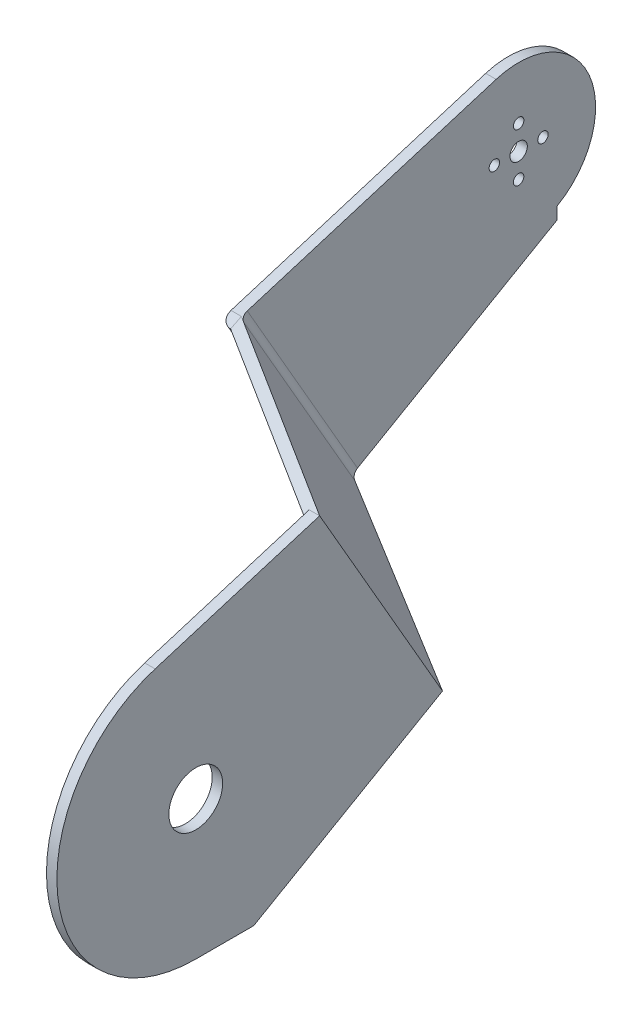
ISO-10303-21;
HEADER;
FILE_DESCRIPTION(('STEP AP214'),'2;1');
FILE_NAME('part.step','',(''),(''),'','','');
FILE_SCHEMA(('AUTOMOTIVE_DESIGN { 1 0 10303 214 1 1 1 1 }'));
ENDSEC;
DATA;
#1=APPLICATION_CONTEXT('core data for automotive mechanical design processes');
#2=APPLICATION_PROTOCOL_DEFINITION('international standard','automotive_design',2000,#1);
#3=PRODUCT_CONTEXT('',#1,'mechanical');
#4=PRODUCT('Part','Part','',(#3));
#5=PRODUCT_RELATED_PRODUCT_CATEGORY('part','',(#4));
#6=PRODUCT_DEFINITION_FORMATION('','',#4);
#7=PRODUCT_DEFINITION_CONTEXT('part definition',#1,'design');
#8=PRODUCT_DEFINITION('design','',#6,#7);
#9=PRODUCT_DEFINITION_SHAPE('','',#8);
#10=(LENGTH_UNIT() NAMED_UNIT(*) SI_UNIT(.MILLI.,.METRE.));
#11=(NAMED_UNIT(*) PLANE_ANGLE_UNIT() SI_UNIT($,.RADIAN.));
#12=(NAMED_UNIT(*) SI_UNIT($,.STERADIAN.) SOLID_ANGLE_UNIT());
#13=UNCERTAINTY_MEASURE_WITH_UNIT(LENGTH_MEASURE(1.E-05),#10,'distance_accuracy_value','');
#14=(GEOMETRIC_REPRESENTATION_CONTEXT(3) GLOBAL_UNCERTAINTY_ASSIGNED_CONTEXT((#13)) GLOBAL_UNIT_ASSIGNED_CONTEXT((#10,
#11,#12)) REPRESENTATION_CONTEXT('',''));
#15=CARTESIAN_POINT('',(0.,0.,0.));
#16=DIRECTION('',(0.,0.,1.));
#17=DIRECTION('',(1.,0.,0.));
#18=AXIS2_PLACEMENT_3D('',#15,#16,#17);
#19=CARTESIAN_POINT('',(251.,0.,0.));
#20=DIRECTION('',(1.,0.,0.));
#21=DIRECTION('',(0.,0.,-1.));
#22=AXIS2_PLACEMENT_3D('',#19,#20,#21);
#23=PLANE('',#22);
#24=DIRECTION('',(0.,0.866377829159594,0.499389083922255));
#25=VECTOR('',#24,1.);
#26=CARTESIAN_POINT('',(251.,27.7260017973894,-48.1011580386023));
#27=LINE('',#26,#25);
#28=CARTESIAN_POINT('',(251.,-9.52824485647312,-69.5748886472593));
#29=VERTEX_POINT('',#28);
#30=CARTESIAN_POINT('',(251.,51.7063736540913,-34.2786252699026));
#31=VERTEX_POINT('',#30);
#32=EDGE_CURVE('E254',#29,#31,#27,.T.);
#33=ORIENTED_EDGE('',*,*,#32,.F.);
#34=DIRECTION('',(0.,0.499389083922256,-0.866377829159594));
#35=VECTOR('',#34,1.);
#36=CARTESIAN_POINT('',(251.,-37.2542466538625,-21.473730608657));
#37=LINE('',#36,#35);
#38=CARTESIAN_POINT('',(251.,-40.,-16.7101907155731));
#39=VERTEX_POINT('',#38);
#40=EDGE_CURVE('E347',#39,#29,#37,.T.);
#41=ORIENTED_EDGE('',*,*,#40,.F.);
#42=DIRECTION('',(0.,0.,-1.));
#43=VECTOR('',#42,1.);
#44=CARTESIAN_POINT('',(251.,-40.,0.));
#45=LINE('',#44,#43);
#46=CARTESIAN_POINT('',(251.,-40.,0.));
#47=VERTEX_POINT('',#46);
#48=EDGE_CURVE('E219',#47,#39,#45,.T.);
#49=ORIENTED_EDGE('',*,*,#48,.F.);
#50=CARTESIAN_POINT('',(251.,0.,0.));
#51=DIRECTION('',(1.,0.,0.));
#52=DIRECTION('',(0.,0.,-1.));
#53=AXIS2_PLACEMENT_3D('',#50,#51,#52);
#54=CIRCLE('',#53,40.);
#55=CARTESIAN_POINT('',(251.,38.2504262101395,11.7006365101509));
#56=VERTEX_POINT('',#55);
#57=EDGE_CURVE('E58',#56,#47,#54,.T.);
#58=ORIENTED_EDGE('',*,*,#57,.F.);
#59=DIRECTION('',(0.,-0.292515912753773,0.956260655253486));
#60=VECTOR('',#59,1.);
#61=CARTESIAN_POINT('',(251.,38.2504262101395,11.7006365101509));
#62=LINE('',#61,#60);
#63=CARTESIAN_POINT('',(251.,52.7438861013477,-35.6797788730056));
#64=VERTEX_POINT('',#63);
#65=EDGE_CURVE('E196',#64,#56,#62,.T.);
#66=ORIENTED_EDGE('',*,*,#65,.F.);
#67=DIRECTION('',(0.,0.866377829159594,0.499389083922256));
#68=VECTOR('',#67,1.);
#69=CARTESIAN_POINT('',(251.,52.7438861013477,-35.6797788730056));
#70=LINE('',#69,#68);
#71=CARTESIAN_POINT('',(251.,52.485068329611,-35.8289640963344));
#72=VERTEX_POINT('',#71);
#73=EDGE_CURVE('E192',#72,#64,#70,.T.);
#74=ORIENTED_EDGE('',*,*,#73,.F.);
#75=DIRECTION('',(0.,-0.448838421555002,0.893612931495518));
#76=VECTOR('',#75,1.);
#77=CARTESIAN_POINT('',(251.,27.541079130089,13.8331642806274));
#78=LINE('',#77,#76);
#79=EDGE_CURVE('E199',#72,#31,#78,.T.);
#80=ORIENTED_EDGE('',*,*,#79,.T.);
#81=EDGE_LOOP('',(#33,#41,#49,#58,#66,#74,#80));
#82=FACE_BOUND('',#81,.T.);
#83=CARTESIAN_POINT('',(251.,0.,0.));
#84=DIRECTION('',(1.,0.,0.));
#85=DIRECTION('',(0.,0.,-1.));
#86=AXIS2_PLACEMENT_3D('',#83,#84,#85);
#87=CIRCLE('',#86,7.75);
#88=CARTESIAN_POINT('',(251.,0.,-7.75));
#89=VERTEX_POINT('',#88);
#90=EDGE_CURVE('E207',#89,#89,#87,.T.);
#91=ORIENTED_EDGE('',*,*,#90,.T.);
#92=EDGE_LOOP('',(#91));
#93=FACE_BOUND('',#92,.T.);
#94=ADVANCED_FACE('F41',(#82,#93),#23,.F.);
#95=CARTESIAN_POINT('',(3.,-40.,0.));
#96=DIRECTION('',(0.,1.,0.));
#97=DIRECTION('',(0.,0.,1.));
#98=AXIS2_PLACEMENT_3D('',#95,#96,#97);
#99=PLANE('',#98);
#100=DIRECTION('',(-1.,0.,0.));
#101=VECTOR('',#100,1.);
#102=CARTESIAN_POINT('',(254.,-40.,0.));
#103=LINE('',#102,#101);
#104=CARTESIAN_POINT('',(254.,-40.,0.));
#105=VERTEX_POINT('',#104);
#106=EDGE_CURVE('E223',#105,#47,#103,.T.);
#107=ORIENTED_EDGE('',*,*,#106,.T.);
#108=ORIENTED_EDGE('',*,*,#48,.T.);
#109=DIRECTION('',(-1.,0.,0.));
#110=VECTOR('',#109,1.);
#111=CARTESIAN_POINT('',(3.,-40.,-16.7101907155731));
#112=LINE('',#111,#110);
#113=CARTESIAN_POINT('',(254.,-40.,-16.7101907155731));
#114=VERTEX_POINT('',#113);
#115=EDGE_CURVE('E45',#114,#39,#112,.T.);
#116=ORIENTED_EDGE('',*,*,#115,.F.);
#117=DIRECTION('',(0.,0.,-1.));
#118=VECTOR('',#117,1.);
#119=CARTESIAN_POINT('',(254.,-40.,0.));
#120=LINE('',#119,#118);
#121=EDGE_CURVE('E215',#105,#114,#120,.T.);
#122=ORIENTED_EDGE('',*,*,#121,.F.);
#123=EDGE_LOOP('',(#107,#108,#116,#122));
#124=FACE_BOUND('',#123,.T.);
#125=ADVANCED_FACE('F43',(#124),#99,.F.);
#126=CARTESIAN_POINT('',(3.,-37.2542466538625,-21.473730608657));
#127=DIRECTION('',(0.,0.866377829159594,0.499389083922256));
#128=DIRECTION('',(0.,-0.499389083922256,0.866377829159594));
#129=AXIS2_PLACEMENT_3D('',#126,#127,#128);
#130=PLANE('',#129);
#131=CARTESIAN_POINT('',(202.,6.09772107490473,-96.683992306114));
#132=DIRECTION('',(0.,0.866377829159594,0.499389083922256));
#133=DIRECTION('',(0.,-0.499389083922256,0.866377829159594));
#134=AXIS2_PLACEMENT_3D('',#131,#132,#133);
#135=CIRCLE('',#134,3.00000000000006);
#136=CARTESIAN_POINT('',(202.,4.59955382313792,-94.0848588186351));
#137=VERTEX_POINT('',#136);
#138=CARTESIAN_POINT('',(199.,6.09772107490468,-96.6839923061139));
#139=VERTEX_POINT('',#138);
#140=EDGE_CURVE('E222',#137,#139,#135,.F.);
#141=ORIENTED_EDGE('',*,*,#140,.T.);
#142=DIRECTION('',(0.,0.499389083922256,-0.866377829159594));
#143=VECTOR('',#142,1.);
#144=CARTESIAN_POINT('',(199.,-37.2542466538625,-21.473730608657));
#145=LINE('',#144,#143);
#146=CARTESIAN_POINT('',(199.,40.3293765594166,-156.071648788865));
#147=VERTEX_POINT('',#146);
#148=EDGE_CURVE('E224',#139,#147,#145,.T.);
#149=ORIENTED_EDGE('',*,*,#148,.T.);
#150=DIRECTION('',(-1.,0.,0.));
#151=VECTOR('',#150,1.);
#152=CARTESIAN_POINT('',(3.,40.3293765594166,-156.071648788865));
#153=LINE('',#152,#151);
#154=CARTESIAN_POINT('',(202.,40.3293765594166,-156.071648788865));
#155=VERTEX_POINT('',#154);
#156=EDGE_CURVE('E140',#155,#147,#153,.T.);
#157=ORIENTED_EDGE('',*,*,#156,.F.);
#158=DIRECTION('',(0.,0.499389083922256,-0.866377829159594));
#159=VECTOR('',#158,1.);
#160=CARTESIAN_POINT('',(202.,-37.2542466538625,-21.473730608657));
#161=LINE('',#160,#159);
#162=CARTESIAN_POINT('',(202.,7.19445562143378,-98.586690074602));
#163=VERTEX_POINT('',#162);
#164=EDGE_CURVE('E168',#163,#155,#161,.T.);
#165=ORIENTED_EDGE('',*,*,#164,.F.);
#166=CARTESIAN_POINT('',(205.,7.19445562143379,-98.586690074602));
#167=DIRECTION('',(0.,0.866377829159594,0.499389083922256));
#168=DIRECTION('',(0.,-0.499389083922256,0.866377829159594));
#169=AXIS2_PLACEMENT_3D('',#166,#167,#168);
#170=CIRCLE('',#169,3.);
#171=CARTESIAN_POINT('',(203.5,5.89700472228584,-96.3357744466186));
#172=VERTEX_POINT('',#171);
#173=EDGE_CURVE('E228',#172,#163,#170,.F.);
#174=ORIENTED_EDGE('',*,*,#173,.F.);
#175=DIRECTION('',(0.866025403784436,-0.24969454196113,0.433188914579801));
#176=VECTOR('',#175,1.);
#177=CARTESIAN_POINT('',(254.,-8.66327759037451,-71.0754990659149));
#178=LINE('',#177,#176);
#179=CARTESIAN_POINT('',(254.,-8.66327759037451,-71.0754990659149));
#180=VERTEX_POINT('',#179);
#181=EDGE_CURVE('E225',#172,#180,#178,.T.);
#182=ORIENTED_EDGE('',*,*,#181,.T.);
#183=DIRECTION('',(0.,0.499389083922255,-0.866377829159594));
#184=VECTOR('',#183,1.);
#185=CARTESIAN_POINT('',(254.,-40.,-16.7101907155731));
#186=LINE('',#185,#184);
#187=EDGE_CURVE('E204',#114,#180,#186,.T.);
#188=ORIENTED_EDGE('',*,*,#187,.F.);
#189=ORIENTED_EDGE('',*,*,#115,.T.);
#190=ORIENTED_EDGE('',*,*,#40,.T.);
#191=DIRECTION('',(-0.866025403784436,0.24969454196113,-0.433188914579801));
#192=VECTOR('',#191,1.);
#193=CARTESIAN_POINT('',(89.0407957191668,37.1682251922945,-150.587445094259));
#194=LINE('',#193,#192);
#195=EDGE_CURVE('E157',#29,#137,#194,.T.);
#196=ORIENTED_EDGE('',*,*,#195,.T.);
#197=EDGE_LOOP('',(#141,#149,#157,#165,#174,#182,#188,#189,#190,#196));
#198=FACE_BOUND('',#197,.T.);
#199=ADVANCED_FACE('F323',(#198),#130,.F.);
#200=CARTESIAN_POINT('',(3.,0.,-156.071648788865));
#201=DIRECTION('',(0.,0.,-1.));
#202=DIRECTION('',(-1.,0.,0.));
#203=AXIS2_PLACEMENT_3D('',#200,#201,#202);
#204=PLANE('',#203);
#205=DIRECTION('',(0.,-1.,0.));
#206=VECTOR('',#205,1.);
#207=CARTESIAN_POINT('',(199.,0.,-156.071648788865));
#208=LINE('',#207,#206);
#209=CARTESIAN_POINT('',(199.,43.7920690464924,-156.071648788865));
#210=VERTEX_POINT('',#209);
#211=EDGE_CURVE('E133',#210,#147,#208,.T.);
#212=ORIENTED_EDGE('',*,*,#211,.F.);
#213=DIRECTION('',(1.,0.,0.));
#214=VECTOR('',#213,1.);
#215=CARTESIAN_POINT('',(199.,43.7920690464924,-156.071648788865));
#216=LINE('',#215,#214);
#217=CARTESIAN_POINT('',(202.,43.7920690464924,-156.071648788865));
#218=VERTEX_POINT('',#217);
#219=EDGE_CURVE('E137',#210,#218,#216,.T.);
#220=ORIENTED_EDGE('',*,*,#219,.T.);
#221=DIRECTION('',(0.,-1.,0.));
#222=VECTOR('',#221,1.);
#223=CARTESIAN_POINT('',(202.,0.,-156.071648788865));
#224=LINE('',#223,#222);
#225=EDGE_CURVE('E156',#218,#155,#224,.T.);
#226=ORIENTED_EDGE('',*,*,#225,.T.);
#227=ORIENTED_EDGE('',*,*,#156,.T.);
#228=EDGE_LOOP('',(#212,#220,#226,#227));
#229=FACE_BOUND('',#228,.T.);
#230=ADVANCED_FACE('F135',(#229),#204,.T.);
#231=CARTESIAN_POINT('',(205.,44.4487022752963,-77.112959465945));
#232=DIRECTION('',(0.,-0.866377829159594,-0.499389083922256));
#233=DIRECTION('',(0.,0.499389083922256,-0.866377829159594));
#234=AXIS2_PLACEMENT_3D('',#231,#232,#233);
#235=CYLINDRICAL_SURFACE('',#234,3.);
#236=DIRECTION('',(0.,-0.866377829159594,-0.499389083922256));
#237=VECTOR('',#236,1.);
#238=CARTESIAN_POINT('',(202.,44.4487022752963,-77.112959465945));
#239=LINE('',#238,#237);
#240=CARTESIAN_POINT('',(202.,62.2749626707045,-66.8377197852876));
#241=VERTEX_POINT('',#240);
#242=EDGE_CURVE('E190',#241,#163,#239,.T.);
#243=ORIENTED_EDGE('',*,*,#242,.F.);
#244=CARTESIAN_POINT('',(205.,62.2749626707045,-66.8377197852876));
#245=DIRECTION('',(0.,-0.956260655253487,-0.292515912753773));
#246=DIRECTION('',(0.,0.292515912753773,-0.956260655253487));
#247=AXIS2_PLACEMENT_3D('',#244,#245,#246);
#248=ELLIPSE('',#247,3.07830504862782,3.);
#249=CARTESIAN_POINT('',(203.5,61.4951473150298,-64.2884337106464));
#250=VERTEX_POINT('',#249);
#251=EDGE_CURVE('E226',#241,#250,#248,.F.);
#252=ORIENTED_EDGE('',*,*,#251,.T.);
#253=DIRECTION('',(0.,-0.866377829159594,-0.499389083922256));
#254=VECTOR('',#253,1.);
#255=CARTESIAN_POINT('',(203.5,8.49613820976462,-94.8376071948518));
#256=LINE('',#255,#254);
#257=EDGE_CURVE('E177',#172,#250,#256,.F.);
#258=ORIENTED_EDGE('',*,*,#257,.F.);
#259=ORIENTED_EDGE('',*,*,#173,.T.);
#260=EDGE_LOOP('',(#243,#252,#258,#259));
#261=FACE_BOUND('',#260,.T.);
#262=ADVANCED_FACE('F317',(#261),#235,.F.);
#263=CARTESIAN_POINT('',(202.,61.6958636676487,-64.6366515701417));
#264=DIRECTION('',(0.,0.866377829159594,0.499389083922255));
#265=DIRECTION('',(0.,-0.499389083922255,0.866377829159594));
#266=AXIS2_PLACEMENT_3D('',#263,#264,#265);
#267=CYLINDRICAL_SURFACE('',#266,3.);
#268=DIRECTION('',(0.,-0.866377829159594,-0.499389083922255));
#269=VECTOR('',#268,1.);
#270=CARTESIAN_POINT('',(202.,41.8538004770004,-72.6111282099781));
#271=LINE('',#270,#269);
#272=CARTESIAN_POINT('',(202.,60.1976964158819,-62.0375180826629));
#273=VERTEX_POINT('',#272);
#274=EDGE_CURVE('E258',#273,#137,#271,.T.);
#275=ORIENTED_EDGE('',*,*,#274,.F.);
#276=CARTESIAN_POINT('',(202.,61.5464351574655,-64.7227836989898));
#277=DIRECTION('',(0.,-0.893612931495518,-0.448838421555002));
#278=DIRECTION('',(0.,-0.448838421555002,0.893612931495519));
#279=AXIS2_PLACEMENT_3D('',#276,#277,#278);
#280=ELLIPSE('',#279,3.00495384711238,3.);
#281=CARTESIAN_POINT('',(199.,61.5464351574655,-64.7227836989898));
#282=VERTEX_POINT('',#281);
#283=EDGE_CURVE('E217',#282,#273,#280,.F.);
#284=ORIENTED_EDGE('',*,*,#283,.F.);
#285=DIRECTION('',(0.,-0.866377829159594,-0.499389083922255));
#286=VECTOR('',#285,1.);
#287=CARTESIAN_POINT('',(199.,61.6958636676487,-64.6366515701417));
#288=LINE('',#287,#286);
#289=EDGE_CURVE('E145',#139,#282,#288,.F.);
#290=ORIENTED_EDGE('',*,*,#289,.F.);
#291=ORIENTED_EDGE('',*,*,#140,.F.);
#292=EDGE_LOOP('',(#275,#284,#290,#291));
#293=FACE_BOUND('',#292,.T.);
#294=ADVANCED_FACE('F335',(#293),#267,.T.);
#295=CARTESIAN_POINT('',(199.,38.2504262101395,11.7006365101509));
#296=DIRECTION('',(0.,-0.956260655253487,-0.292515912753773));
#297=DIRECTION('',(0.,0.292515912753773,-0.956260655253487));
#298=AXIS2_PLACEMENT_3D('',#295,#296,#297);
#299=PLANE('',#298);
#300=DIRECTION('',(0.,0.292515912753773,-0.956260655253487));
#301=VECTOR('',#300,1.);
#302=CARTESIAN_POINT('',(199.,38.2504262101395,11.7006365101509));
#303=LINE('',#302,#301);
#304=CARTESIAN_POINT('',(199.,61.7550857669214,-65.1381957355268));
#305=VERTEX_POINT('',#304);
#306=CARTESIAN_POINT('',(199.,84.2006679089215,-138.51480928312));
#307=VERTEX_POINT('',#306);
#308=EDGE_CURVE('E162',#305,#307,#303,.T.);
#309=ORIENTED_EDGE('',*,*,#308,.F.);
#310=DIRECTION('',(1.,0.,0.));
#311=VECTOR('',#310,1.);
#312=CARTESIAN_POINT('',(182.,61.7550857669214,-65.1381957355268));
#313=LINE('',#312,#311);
#314=CARTESIAN_POINT('',(202.,61.7550857669214,-65.1381957355268));
#315=VERTEX_POINT('',#314);
#316=EDGE_CURVE('E67',#305,#315,#313,.T.);
#317=ORIENTED_EDGE('',*,*,#316,.T.);
#318=DIRECTION('',(0.860356620434527,-0.149093178660264,0.487398922599812));
#319=VECTOR('',#318,1.);
#320=CARTESIAN_POINT('',(202.,61.7550857669214,-65.1381957355268));
#321=LINE('',#320,#319);
#322=EDGE_CURVE('E249',#315,#250,#321,.T.);
#323=ORIENTED_EDGE('',*,*,#322,.T.);
#324=ORIENTED_EDGE('',*,*,#251,.F.);
#325=DIRECTION('',(0.,0.292515912753773,-0.956260655253487));
#326=VECTOR('',#325,1.);
#327=CARTESIAN_POINT('',(202.,38.2504262101395,11.7006365101509));
#328=LINE('',#327,#326);
#329=CARTESIAN_POINT('',(202.,84.2006679089215,-138.51480928312));
#330=VERTEX_POINT('',#329);
#331=EDGE_CURVE('E146',#241,#330,#328,.T.);
#332=ORIENTED_EDGE('',*,*,#331,.T.);
#333=DIRECTION('',(1.,0.,0.));
#334=VECTOR('',#333,1.);
#335=CARTESIAN_POINT('',(199.,84.2006679089215,-138.51480928312));
#336=LINE('',#335,#334);
#337=EDGE_CURVE('E164',#307,#330,#336,.T.);
#338=ORIENTED_EDGE('',*,*,#337,.F.);
#339=EDGE_LOOP('',(#309,#317,#323,#324,#332,#338));
#340=FACE_BOUND('',#339,.T.);
#341=ADVANCED_FACE('F315',(#340),#299,.F.);
#342=CARTESIAN_POINT('',(199.,0.,0.));
#343=DIRECTION('',(-1.,0.,0.));
#344=DIRECTION('',(0.,0.,-1.));
#345=AXIS2_PLACEMENT_3D('',#342,#343,#344);
#346=PLANE('',#345);
#347=CARTESIAN_POINT('',(199.,63.,-145.));
#348=DIRECTION('',(1.,0.,0.));
#349=DIRECTION('',(0.,0.,-1.));
#350=AXIS2_PLACEMENT_3D('',#347,#348,#349);
#351=CIRCLE('',#350,22.1703860683274);
#352=EDGE_CURVE('E153',#210,#307,#351,.T.);
#353=ORIENTED_EDGE('',*,*,#352,.F.);
#354=ORIENTED_EDGE('',*,*,#211,.T.);
#355=ORIENTED_EDGE('',*,*,#148,.F.);
#356=ORIENTED_EDGE('',*,*,#289,.T.);
#357=DIRECTION('',(0.,-0.448838421555002,0.893612931495519));
#358=VECTOR('',#357,1.);
#359=CARTESIAN_POINT('',(199.,23.1880208405676,11.6467368658676));
#360=LINE('',#359,#358);
#361=EDGE_CURVE('E245',#305,#282,#360,.T.);
#362=ORIENTED_EDGE('',*,*,#361,.F.);
#363=ORIENTED_EDGE('',*,*,#308,.T.);
#364=EDGE_LOOP('',(#353,#354,#355,#356,#362,#363));
#365=FACE_BOUND('',#364,.T.);
#366=CARTESIAN_POINT('',(199.,62.9999999999999,-138.));
#367=DIRECTION('',(1.,0.,0.));
#368=DIRECTION('',(0.,0.,-1.));
#369=AXIS2_PLACEMENT_3D('',#366,#367,#368);
#370=CIRCLE('',#369,1.50000000000003);
#371=CARTESIAN_POINT('',(199.,62.9999999999999,-139.5));
#372=VERTEX_POINT('',#371);
#373=EDGE_CURVE('E251',#372,#372,#370,.T.);
#374=ORIENTED_EDGE('',*,*,#373,.T.);
#375=EDGE_LOOP('',(#374));
#376=FACE_BOUND('',#375,.T.);
#377=CARTESIAN_POINT('',(199.,56.,-145.));
#378=DIRECTION('',(1.,0.,0.));
#379=DIRECTION('',(0.,0.,-1.));
#380=AXIS2_PLACEMENT_3D('',#377,#378,#379);
#381=CIRCLE('',#380,1.5);
#382=CARTESIAN_POINT('',(199.,56.,-146.5));
#383=VERTEX_POINT('',#382);
#384=EDGE_CURVE('E277',#383,#383,#381,.T.);
#385=ORIENTED_EDGE('',*,*,#384,.T.);
#386=EDGE_LOOP('',(#385));
#387=FACE_BOUND('',#386,.T.);
#388=CARTESIAN_POINT('',(199.,63.,-152.));
#389=DIRECTION('',(1.,0.,0.));
#390=DIRECTION('',(0.,0.,-1.));
#391=AXIS2_PLACEMENT_3D('',#388,#389,#390);
#392=CIRCLE('',#391,1.5);
#393=CARTESIAN_POINT('',(199.,63.,-153.5));
#394=VERTEX_POINT('',#393);
#395=EDGE_CURVE('E280',#394,#394,#392,.T.);
#396=ORIENTED_EDGE('',*,*,#395,.T.);
#397=EDGE_LOOP('',(#396));
#398=FACE_BOUND('',#397,.T.);
#399=CARTESIAN_POINT('',(199.,70.,-145.));
#400=DIRECTION('',(1.,0.,0.));
#401=DIRECTION('',(0.,0.,-1.));
#402=AXIS2_PLACEMENT_3D('',#399,#400,#401);
#403=CIRCLE('',#402,1.5);
#404=CARTESIAN_POINT('',(199.,70.,-146.5));
#405=VERTEX_POINT('',#404);
#406=EDGE_CURVE('E282',#405,#405,#403,.T.);
#407=ORIENTED_EDGE('',*,*,#406,.T.);
#408=EDGE_LOOP('',(#407));
#409=FACE_BOUND('',#408,.T.);
#410=CARTESIAN_POINT('',(199.,63.,-145.));
#411=DIRECTION('',(1.,0.,0.));
#412=DIRECTION('',(0.,0.,-1.));
#413=AXIS2_PLACEMENT_3D('',#410,#411,#412);
#414=CIRCLE('',#413,2.5);
#415=CARTESIAN_POINT('',(199.,63.,-147.5));
#416=VERTEX_POINT('',#415);
#417=EDGE_CURVE('E172',#416,#416,#414,.T.);
#418=ORIENTED_EDGE('',*,*,#417,.T.);
#419=EDGE_LOOP('',(#418));
#420=FACE_BOUND('',#419,.T.);
#421=ADVANCED_FACE('F159',(#365,#376,#387,#398,#409,#420),#346,.T.);
#422=CARTESIAN_POINT('',(254.,0.,0.));
#423=DIRECTION('',(-1.,0.,0.));
#424=DIRECTION('',(0.,0.,1.));
#425=AXIS2_PLACEMENT_3D('',#422,#423,#424);
#426=CYLINDRICAL_SURFACE('',#425,40.);
#427=ORIENTED_EDGE('',*,*,#106,.F.);
#428=CARTESIAN_POINT('',(254.,0.,0.));
#429=DIRECTION('',(1.,0.,0.));
#430=DIRECTION('',(0.,0.,-1.));
#431=AXIS2_PLACEMENT_3D('',#428,#429,#430);
#432=CIRCLE('',#431,40.);
#433=CARTESIAN_POINT('',(254.,38.2504262101395,11.7006365101509));
#434=VERTEX_POINT('',#433);
#435=EDGE_CURVE('E212',#434,#105,#432,.T.);
#436=ORIENTED_EDGE('',*,*,#435,.F.);
#437=DIRECTION('',(1.,0.,0.));
#438=VECTOR('',#437,1.);
#439=CARTESIAN_POINT('',(251.,38.2504262101395,11.7006365101509));
#440=LINE('',#439,#438);
#441=EDGE_CURVE('E195',#56,#434,#440,.T.);
#442=ORIENTED_EDGE('',*,*,#441,.F.);
#443=ORIENTED_EDGE('',*,*,#57,.T.);
#444=EDGE_LOOP('',(#427,#436,#442,#443));
#445=FACE_BOUND('',#444,.T.);
#446=ADVANCED_FACE('F359',(#445),#426,.T.);
#447=CARTESIAN_POINT('',(254.,0.,0.));
#448=DIRECTION('',(1.,0.,0.));
#449=DIRECTION('',(0.,0.,-1.));
#450=AXIS2_PLACEMENT_3D('',#447,#448,#449);
#451=PLANE('',#450);
#452=CARTESIAN_POINT('',(254.,0.,0.));
#453=DIRECTION('',(1.,0.,0.));
#454=DIRECTION('',(0.,0.,-1.));
#455=AXIS2_PLACEMENT_3D('',#452,#453,#454);
#456=CIRCLE('',#455,7.75);
#457=CARTESIAN_POINT('',(254.,0.,-7.75));
#458=VERTEX_POINT('',#457);
#459=EDGE_CURVE('E11',#458,#458,#456,.T.);
#460=ORIENTED_EDGE('',*,*,#459,.F.);
#461=EDGE_LOOP('',(#460));
#462=FACE_BOUND('',#461,.T.);
#463=ORIENTED_EDGE('',*,*,#435,.T.);
#464=ORIENTED_EDGE('',*,*,#121,.T.);
#465=ORIENTED_EDGE('',*,*,#187,.T.);
#466=DIRECTION('',(0.,0.866377829159594,0.499389083922256));
#467=VECTOR('',#466,1.);
#468=CARTESIAN_POINT('',(254.,52.7438861013477,-35.6797788730056));
#469=LINE('',#468,#467);
#470=CARTESIAN_POINT('',(254.,52.7438861013477,-35.6797788730056));
#471=VERTEX_POINT('',#470);
#472=EDGE_CURVE('E200',#180,#471,#469,.T.);
#473=ORIENTED_EDGE('',*,*,#472,.T.);
#474=DIRECTION('',(0.,-0.292515912753773,0.956260655253486));
#475=VECTOR('',#474,1.);
#476=CARTESIAN_POINT('',(254.,38.2504262101395,11.7006365101509));
#477=LINE('',#476,#475);
#478=EDGE_CURVE('E203',#471,#434,#477,.T.);
#479=ORIENTED_EDGE('',*,*,#478,.T.);
#480=EDGE_LOOP('',(#463,#464,#465,#473,#479));
#481=FACE_BOUND('',#480,.T.);
#482=ADVANCED_FACE('F356',(#462,#481),#451,.T.);
#483=CARTESIAN_POINT('',(251.,38.2504262101395,11.7006365101509));
#484=DIRECTION('',(0.,0.956260655253486,0.292515912753773));
#485=DIRECTION('',(0.,-0.292515912753773,0.956260655253487));
#486=AXIS2_PLACEMENT_3D('',#483,#484,#485);
#487=PLANE('',#486);
#488=ORIENTED_EDGE('',*,*,#478,.F.);
#489=DIRECTION('',(1.,0.,0.));
#490=VECTOR('',#489,1.);
#491=CARTESIAN_POINT('',(251.,52.7438861013477,-35.6797788730056));
#492=LINE('',#491,#490);
#493=EDGE_CURVE('E194',#64,#471,#492,.T.);
#494=ORIENTED_EDGE('',*,*,#493,.F.);
#495=ORIENTED_EDGE('',*,*,#65,.T.);
#496=ORIENTED_EDGE('',*,*,#441,.T.);
#497=EDGE_LOOP('',(#488,#494,#495,#496));
#498=FACE_BOUND('',#497,.T.);
#499=ADVANCED_FACE('F358',(#498),#487,.T.);
#500=CARTESIAN_POINT('',(251.,52.7438861013477,-35.6797788730056));
#501=DIRECTION('',(0.,0.499389083922256,-0.866377829159593));
#502=DIRECTION('',(0.,0.866377829159594,0.499389083922256));
#503=AXIS2_PLACEMENT_3D('',#500,#501,#502);
#504=PLANE('',#503);
#505=DIRECTION('',(0.995078632440276,0.0858480114503153,0.0494836760034669));
#506=VECTOR('',#505,1.);
#507=CARTESIAN_POINT('',(251.029455545782,52.4876095358526,-35.8274993189425));
#508=LINE('',#507,#506);
#509=EDGE_CURVE('E259',#72,#471,#508,.T.);
#510=ORIENTED_EDGE('',*,*,#509,.F.);
#511=ORIENTED_EDGE('',*,*,#73,.T.);
#512=ORIENTED_EDGE('',*,*,#493,.T.);
#513=EDGE_LOOP('',(#510,#511,#512));
#514=FACE_BOUND('',#513,.T.);
#515=ADVANCED_FACE('F300',(#514),#504,.T.);
#516=CARTESIAN_POINT('',(202.,0.,0.));
#517=DIRECTION('',(-1.,0.,0.));
#518=DIRECTION('',(0.,0.,-1.));
#519=AXIS2_PLACEMENT_3D('',#516,#517,#518);
#520=PLANE('',#519);
#521=CARTESIAN_POINT('',(202.,63.,-145.));
#522=DIRECTION('',(1.,0.,0.));
#523=DIRECTION('',(0.,0.,-1.));
#524=AXIS2_PLACEMENT_3D('',#521,#522,#523);
#525=CIRCLE('',#524,2.5);
#526=CARTESIAN_POINT('',(202.,63.,-147.5));
#527=VERTEX_POINT('',#526);
#528=EDGE_CURVE('E166',#527,#527,#525,.T.);
#529=ORIENTED_EDGE('',*,*,#528,.F.);
#530=EDGE_LOOP('',(#529));
#531=FACE_BOUND('',#530,.T.);
#532=CARTESIAN_POINT('',(202.,70.,-145.));
#533=DIRECTION('',(1.,0.,0.));
#534=DIRECTION('',(0.,0.,-1.));
#535=AXIS2_PLACEMENT_3D('',#532,#533,#534);
#536=CIRCLE('',#535,1.5);
#537=CARTESIAN_POINT('',(202.,70.,-146.5));
#538=VERTEX_POINT('',#537);
#539=EDGE_CURVE('E184',#538,#538,#536,.T.);
#540=ORIENTED_EDGE('',*,*,#539,.F.);
#541=EDGE_LOOP('',(#540));
#542=FACE_BOUND('',#541,.T.);
#543=CARTESIAN_POINT('',(202.,63.,-152.));
#544=DIRECTION('',(1.,0.,0.));
#545=DIRECTION('',(0.,0.,-1.));
#546=AXIS2_PLACEMENT_3D('',#543,#544,#545);
#547=CIRCLE('',#546,1.5);
#548=CARTESIAN_POINT('',(202.,63.,-153.5));
#549=VERTEX_POINT('',#548);
#550=EDGE_CURVE('E181',#549,#549,#547,.T.);
#551=ORIENTED_EDGE('',*,*,#550,.F.);
#552=EDGE_LOOP('',(#551));
#553=FACE_BOUND('',#552,.T.);
#554=CARTESIAN_POINT('',(202.,56.,-145.));
#555=DIRECTION('',(1.,0.,0.));
#556=DIRECTION('',(0.,0.,-1.));
#557=AXIS2_PLACEMENT_3D('',#554,#555,#556);
#558=CIRCLE('',#557,1.5);
#559=CARTESIAN_POINT('',(202.,56.,-146.5));
#560=VERTEX_POINT('',#559);
#561=EDGE_CURVE('E178',#560,#560,#558,.T.);
#562=ORIENTED_EDGE('',*,*,#561,.F.);
#563=EDGE_LOOP('',(#562));
#564=FACE_BOUND('',#563,.T.);
#565=CARTESIAN_POINT('',(202.,62.9999999999999,-138.));
#566=DIRECTION('',(1.,0.,0.));
#567=DIRECTION('',(0.,0.,-1.));
#568=AXIS2_PLACEMENT_3D('',#565,#566,#567);
#569=CIRCLE('',#568,1.50000000000003);
#570=CARTESIAN_POINT('',(202.,62.9999999999999,-139.5));
#571=VERTEX_POINT('',#570);
#572=EDGE_CURVE('E174',#571,#571,#569,.T.);
#573=ORIENTED_EDGE('',*,*,#572,.F.);
#574=EDGE_LOOP('',(#573));
#575=FACE_BOUND('',#574,.T.);
#576=ORIENTED_EDGE('',*,*,#331,.F.);
#577=ORIENTED_EDGE('',*,*,#242,.T.);
#578=ORIENTED_EDGE('',*,*,#164,.T.);
#579=ORIENTED_EDGE('',*,*,#225,.F.);
#580=CARTESIAN_POINT('',(202.,63.,-145.));
#581=DIRECTION('',(1.,0.,0.));
#582=DIRECTION('',(0.,0.,-1.));
#583=AXIS2_PLACEMENT_3D('',#580,#581,#582);
#584=CIRCLE('',#583,22.1703860683274);
#585=EDGE_CURVE('E155',#218,#330,#584,.T.);
#586=ORIENTED_EDGE('',*,*,#585,.T.);
#587=EDGE_LOOP('',(#576,#577,#578,#579,#586));
#588=FACE_BOUND('',#587,.T.);
#589=ADVANCED_FACE('F297',(#531,#542,#553,#564,#575,#588),#520,.F.);
#590=CARTESIAN_POINT('',(199.,63.,-145.));
#591=DIRECTION('',(1.,0.,0.));
#592=DIRECTION('',(0.,0.,-1.));
#593=AXIS2_PLACEMENT_3D('',#590,#591,#592);
#594=CYLINDRICAL_SURFACE('',#593,22.1703860683274);
#595=ORIENTED_EDGE('',*,*,#585,.F.);
#596=ORIENTED_EDGE('',*,*,#219,.F.);
#597=ORIENTED_EDGE('',*,*,#352,.T.);
#598=ORIENTED_EDGE('',*,*,#337,.T.);
#599=EDGE_LOOP('',(#595,#596,#597,#598));
#600=FACE_BOUND('',#599,.T.);
#601=ADVANCED_FACE('F151',(#600),#594,.T.);
#602=CARTESIAN_POINT('',(199.,63.,-145.));
#603=DIRECTION('',(1.,0.,0.));
#604=DIRECTION('',(0.,0.,-1.));
#605=AXIS2_PLACEMENT_3D('',#602,#603,#604);
#606=CYLINDRICAL_SURFACE('',#605,2.5);
#607=ORIENTED_EDGE('',*,*,#417,.F.);
#608=EDGE_LOOP('',(#607));
#609=FACE_BOUND('',#608,.T.);
#610=ORIENTED_EDGE('',*,*,#528,.T.);
#611=EDGE_LOOP('',(#610));
#612=FACE_BOUND('',#611,.T.);
#613=ADVANCED_FACE('F290',(#609,#612),#606,.F.);
#614=CARTESIAN_POINT('',(199.,70.,-145.));
#615=DIRECTION('',(1.,0.,0.));
#616=DIRECTION('',(0.,0.,-1.));
#617=AXIS2_PLACEMENT_3D('',#614,#615,#616);
#618=CYLINDRICAL_SURFACE('',#617,1.5);
#619=ORIENTED_EDGE('',*,*,#406,.F.);
#620=EDGE_LOOP('',(#619));
#621=FACE_BOUND('',#620,.T.);
#622=ORIENTED_EDGE('',*,*,#539,.T.);
#623=EDGE_LOOP('',(#622));
#624=FACE_BOUND('',#623,.T.);
#625=ADVANCED_FACE('F293',(#621,#624),#618,.F.);
#626=CARTESIAN_POINT('',(199.,63.,-152.));
#627=DIRECTION('',(1.,0.,0.));
#628=DIRECTION('',(0.,0.,-1.));
#629=AXIS2_PLACEMENT_3D('',#626,#627,#628);
#630=CYLINDRICAL_SURFACE('',#629,1.5);
#631=ORIENTED_EDGE('',*,*,#395,.F.);
#632=EDGE_LOOP('',(#631));
#633=FACE_BOUND('',#632,.T.);
#634=ORIENTED_EDGE('',*,*,#550,.T.);
#635=EDGE_LOOP('',(#634));
#636=FACE_BOUND('',#635,.T.);
#637=ADVANCED_FACE('F409',(#633,#636),#630,.F.);
#638=CARTESIAN_POINT('',(199.,56.,-145.));
#639=DIRECTION('',(1.,0.,0.));
#640=DIRECTION('',(0.,0.,-1.));
#641=AXIS2_PLACEMENT_3D('',#638,#639,#640);
#642=CYLINDRICAL_SURFACE('',#641,1.5);
#643=ORIENTED_EDGE('',*,*,#384,.F.);
#644=EDGE_LOOP('',(#643));
#645=FACE_BOUND('',#644,.T.);
#646=ORIENTED_EDGE('',*,*,#561,.T.);
#647=EDGE_LOOP('',(#646));
#648=FACE_BOUND('',#647,.T.);
#649=ADVANCED_FACE('F413',(#645,#648),#642,.F.);
#650=CARTESIAN_POINT('',(199.,62.9999999999999,-138.));
#651=DIRECTION('',(1.,0.,0.));
#652=DIRECTION('',(0.,0.,-1.));
#653=AXIS2_PLACEMENT_3D('',#650,#651,#652);
#654=CYLINDRICAL_SURFACE('',#653,1.50000000000003);
#655=ORIENTED_EDGE('',*,*,#373,.F.);
#656=EDGE_LOOP('',(#655));
#657=FACE_BOUND('',#656,.T.);
#658=ORIENTED_EDGE('',*,*,#572,.T.);
#659=EDGE_LOOP('',(#658));
#660=FACE_BOUND('',#659,.T.);
#661=ADVANCED_FACE('F404',(#657,#660),#654,.F.);
#662=CARTESIAN_POINT('',(254.,-6.06414410289573,-69.5773318141481));
#663=DIRECTION('',(0.500000000000004,0.432483633049311,-0.75030520932782));
#664=DIRECTION('',(-0.832154434739251,0.,-0.554543953842973));
#665=AXIS2_PLACEMENT_3D('',#662,#663,#664);
#666=PLANE('',#665);
#667=ORIENTED_EDGE('',*,*,#181,.F.);
#668=ORIENTED_EDGE('',*,*,#257,.T.);
#669=EDGE_CURVE('E240',#250,#471,#321,.T.);
#670=ORIENTED_EDGE('',*,*,#669,.T.);
#671=ORIENTED_EDGE('',*,*,#472,.F.);
#672=EDGE_LOOP('',(#667,#668,#670,#671));
#673=FACE_BOUND('',#672,.T.);
#674=ADVANCED_FACE('F401',(#673),#666,.T.);
#675=CARTESIAN_POINT('',(200.5,60.4576348677735,-62.8872801075433));
#676=DIRECTION('',(-0.0989266681662471,0.889229515491612,0.446636746253684));
#677=DIRECTION('',(0.,-0.448838421555002,0.893612931495518));
#678=AXIS2_PLACEMENT_3D('',#675,#676,#677);
#679=PLANE('',#678);
#680=ORIENTED_EDGE('',*,*,#79,.F.);
#681=ORIENTED_EDGE('',*,*,#509,.T.);
#682=ORIENTED_EDGE('',*,*,#669,.F.);
#683=ORIENTED_EDGE('',*,*,#322,.F.);
#684=DIRECTION('',(0.,0.448838421555002,-0.893612931495518));
#685=VECTOR('',#684,1.);
#686=CARTESIAN_POINT('',(202.,23.1880208405675,11.6467368658675));
#687=LINE('',#686,#685);
#688=EDGE_CURVE('E50',#273,#315,#687,.T.);
#689=ORIENTED_EDGE('',*,*,#688,.F.);
#690=DIRECTION('',(0.860356620434527,-0.149093178660264,0.487398922599812));
#691=VECTOR('',#690,1.);
#692=CARTESIAN_POINT('',(200.5,60.4576348677735,-62.8872801075433));
#693=LINE('',#692,#691);
#694=EDGE_CURVE('E255',#273,#31,#693,.T.);
#695=ORIENTED_EDGE('',*,*,#694,.T.);
#696=EDGE_LOOP('',(#680,#681,#682,#683,#689,#695));
#697=FACE_BOUND('',#696,.T.);
#698=ADVANCED_FACE('F341',(#697),#679,.T.);
#699=CARTESIAN_POINT('',(86.7907957191667,75.0711972957309,-130.239172299594));
#700=DIRECTION('',(0.500000000000005,0.432483633049311,-0.750305209327821));
#701=DIRECTION('',(-0.832154434739251,0.,-0.554543953842973));
#702=AXIS2_PLACEMENT_3D('',#699,#700,#701);
#703=PLANE('',#702);
#704=ORIENTED_EDGE('',*,*,#274,.T.);
#705=ORIENTED_EDGE('',*,*,#195,.F.);
#706=ORIENTED_EDGE('',*,*,#32,.T.);
#707=ORIENTED_EDGE('',*,*,#694,.F.);
#708=EDGE_LOOP('',(#704,#705,#706,#707));
#709=FACE_BOUND('',#708,.T.);
#710=ADVANCED_FACE('F343',(#709),#703,.F.);
#711=CARTESIAN_POINT('',(182.,60.1976964158819,-62.0375180826629));
#712=DIRECTION('',(0.,-0.893612931495518,-0.448838421555002));
#713=DIRECTION('',(0.,0.448838421555002,-0.893612931495519));
#714=AXIS2_PLACEMENT_3D('',#711,#712,#713);
#715=PLANE('',#714);
#716=ORIENTED_EDGE('',*,*,#361,.T.);
#717=ORIENTED_EDGE('',*,*,#283,.T.);
#718=ORIENTED_EDGE('',*,*,#688,.T.);
#719=ORIENTED_EDGE('',*,*,#316,.F.);
#720=EDGE_LOOP('',(#716,#717,#718,#719));
#721=FACE_BOUND('',#720,.T.);
#722=ADVANCED_FACE('F331',(#721),#715,.F.);
#723=CARTESIAN_POINT('',(244.,0.,0.));
#724=DIRECTION('',(1.,0.,0.));
#725=DIRECTION('',(0.,0.,-1.));
#726=AXIS2_PLACEMENT_3D('',#723,#724,#725);
#727=CYLINDRICAL_SURFACE('',#726,7.75);
#728=ORIENTED_EDGE('',*,*,#459,.T.);
#729=EDGE_LOOP('',(#728));
#730=FACE_BOUND('',#729,.T.);
#731=ORIENTED_EDGE('',*,*,#90,.F.);
#732=EDGE_LOOP('',(#731));
#733=FACE_BOUND('',#732,.T.);
#734=ADVANCED_FACE('F368',(#730,#733),#727,.F.);
#735=CLOSED_SHELL('',(#94,#125,#199,#230,#262,#294,#341,#421,#446,#482,#499,#515,#589,#601,#613,
#625,#637,#649,#661,#674,#698,#710,#722,#734));
#736=MANIFOLD_SOLID_BREP('B2',#735);
#737=ADVANCED_BREP_SHAPE_REPRESENTATION('',(#18,#736),#14);
#738=SHAPE_DEFINITION_REPRESENTATION(#9,#737);
ENDSEC;
END-ISO-10303-21;
